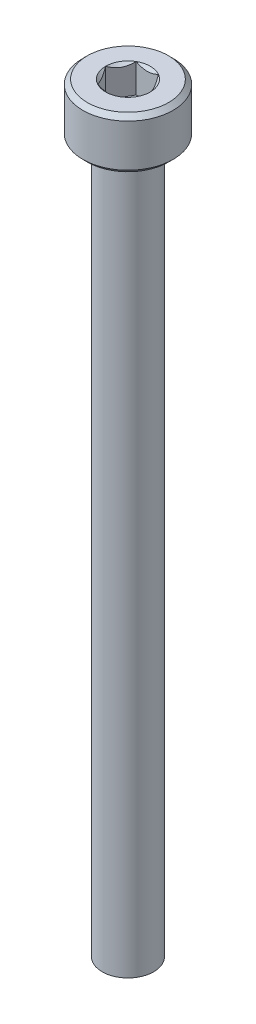
ISO-10303-21;
HEADER;
FILE_DESCRIPTION(('STEP AP214'),'2;1');
FILE_NAME('part.step','',(''),(''),'','','');
FILE_SCHEMA(('AUTOMOTIVE_DESIGN { 1 0 10303 214 1 1 1 1 }'));
ENDSEC;
DATA;
#1=APPLICATION_CONTEXT('core data for automotive mechanical design processes');
#2=APPLICATION_PROTOCOL_DEFINITION('international standard','automotive_design',2000,#1);
#3=PRODUCT_CONTEXT('',#1,'mechanical');
#4=PRODUCT('Part','Part','',(#3));
#5=PRODUCT_RELATED_PRODUCT_CATEGORY('part','',(#4));
#6=PRODUCT_DEFINITION_FORMATION('','',#4);
#7=PRODUCT_DEFINITION_CONTEXT('part definition',#1,'design');
#8=PRODUCT_DEFINITION('design','',#6,#7);
#9=PRODUCT_DEFINITION_SHAPE('','',#8);
#10=(LENGTH_UNIT() NAMED_UNIT(*) SI_UNIT(.MILLI.,.METRE.));
#11=(NAMED_UNIT(*) PLANE_ANGLE_UNIT() SI_UNIT($,.RADIAN.));
#12=(NAMED_UNIT(*) SI_UNIT($,.STERADIAN.) SOLID_ANGLE_UNIT());
#13=UNCERTAINTY_MEASURE_WITH_UNIT(LENGTH_MEASURE(1.E-05),#10,'distance_accuracy_value','');
#14=(GEOMETRIC_REPRESENTATION_CONTEXT(3) GLOBAL_UNCERTAINTY_ASSIGNED_CONTEXT((#13)) GLOBAL_UNIT_ASSIGNED_CONTEXT((#10,
#11,#12)) REPRESENTATION_CONTEXT('',''));
#15=CARTESIAN_POINT('',(0.,0.,0.));
#16=DIRECTION('',(0.,0.,1.));
#17=DIRECTION('',(1.,0.,0.));
#18=AXIS2_PLACEMENT_3D('',#15,#16,#17);
#19=CARTESIAN_POINT('',(0.,4.,0.));
#20=DIRECTION('',(0.,-1.,0.));
#21=DIRECTION('',(0.,0.,-1.));
#22=AXIS2_PLACEMENT_3D('',#19,#20,#21);
#23=CYLINDRICAL_SURFACE('',#22,3.5);
#24=CARTESIAN_POINT('',(0.,0.350000000000001,0.));
#25=DIRECTION('',(0.,1.,0.));
#26=DIRECTION('',(0.,0.,1.));
#27=AXIS2_PLACEMENT_3D('',#24,#25,#26);
#28=CIRCLE('',#27,3.5);
#29=CARTESIAN_POINT('',(0.,0.350000000000001,3.5));
#30=VERTEX_POINT('',#29);
#31=EDGE_CURVE('E222',#30,#30,#28,.T.);
#32=ORIENTED_EDGE('',*,*,#31,.T.);
#33=EDGE_LOOP('',(#32));
#34=FACE_BOUND('',#33,.T.);
#35=CARTESIAN_POINT('',(0.,3.65,0.));
#36=DIRECTION('',(0.,1.,0.));
#37=DIRECTION('',(0.,0.,1.));
#38=AXIS2_PLACEMENT_3D('',#35,#36,#37);
#39=CIRCLE('',#38,3.5);
#40=CARTESIAN_POINT('',(0.,3.65,3.5));
#41=VERTEX_POINT('',#40);
#42=EDGE_CURVE('E105',#41,#41,#39,.F.);
#43=ORIENTED_EDGE('',*,*,#42,.T.);
#44=EDGE_LOOP('',(#43));
#45=FACE_BOUND('',#44,.T.);
#46=ADVANCED_FACE('F33',(#34,#45),#23,.T.);
#47=CARTESIAN_POINT('',(0.,4.,0.));
#48=DIRECTION('',(0.,1.,0.));
#49=DIRECTION('',(0.,0.,1.));
#50=AXIS2_PLACEMENT_3D('',#47,#48,#49);
#51=PLANE('',#50);
#52=CARTESIAN_POINT('',(0.,4.,0.));
#53=DIRECTION('',(0.,1.,0.));
#54=DIRECTION('',(0.,0.,1.));
#55=AXIS2_PLACEMENT_3D('',#52,#53,#54);
#56=CIRCLE('',#55,3.15);
#57=CARTESIAN_POINT('',(0.,4.,3.15));
#58=VERTEX_POINT('',#57);
#59=EDGE_CURVE('E37',#58,#58,#56,.T.);
#60=ORIENTED_EDGE('',*,*,#59,.T.);
#61=EDGE_LOOP('',(#60));
#62=FACE_BOUND('',#61,.T.);
#63=CARTESIAN_POINT('',(0.,4.,0.));
#64=DIRECTION('',(0.,1.,0.));
#65=DIRECTION('',(0.,0.,1.));
#66=AXIS2_PLACEMENT_3D('',#63,#64,#65);
#67=CIRCLE('',#66,1.73205080756888);
#68=CARTESIAN_POINT('',(0.866025403784438,4.,1.5));
#69=VERTEX_POINT('',#68);
#70=CARTESIAN_POINT('',(1.73205080756888,4.,0.));
#71=VERTEX_POINT('',#70);
#72=EDGE_CURVE('E48',#69,#71,#67,.T.);
#73=ORIENTED_EDGE('',*,*,#72,.F.);
#74=CARTESIAN_POINT('',(-0.866025403784438,4.,1.5));
#75=VERTEX_POINT('',#74);
#76=EDGE_CURVE('E55',#75,#69,#67,.T.);
#77=ORIENTED_EDGE('',*,*,#76,.F.);
#78=CARTESIAN_POINT('',(-1.73205080756888,4.,0.));
#79=VERTEX_POINT('',#78);
#80=EDGE_CURVE('E128',#79,#75,#67,.T.);
#81=ORIENTED_EDGE('',*,*,#80,.F.);
#82=CARTESIAN_POINT('',(-0.866025403784439,4.,-1.5));
#83=VERTEX_POINT('',#82);
#84=EDGE_CURVE('E127',#83,#79,#67,.T.);
#85=ORIENTED_EDGE('',*,*,#84,.F.);
#86=CARTESIAN_POINT('',(0.866025403784438,4.,-1.5));
#87=VERTEX_POINT('',#86);
#88=EDGE_CURVE('E95',#87,#83,#67,.T.);
#89=ORIENTED_EDGE('',*,*,#88,.F.);
#90=EDGE_CURVE('E87',#71,#87,#67,.T.);
#91=ORIENTED_EDGE('',*,*,#90,.F.);
#92=EDGE_LOOP('',(#73,#77,#81,#85,#89,#91));
#93=FACE_BOUND('',#92,.T.);
#94=ADVANCED_FACE('F125',(#62,#93),#51,.T.);
#95=CARTESIAN_POINT('',(0.,0.,0.));
#96=DIRECTION('',(0.,1.,0.));
#97=DIRECTION('',(0.,0.,1.));
#98=AXIS2_PLACEMENT_3D('',#95,#96,#97);
#99=PLANE('',#98);
#100=CARTESIAN_POINT('',(0.,0.,0.));
#101=DIRECTION('',(0.,-1.,0.));
#102=DIRECTION('',(0.,0.,-1.));
#103=AXIS2_PLACEMENT_3D('',#100,#101,#102);
#104=CIRCLE('',#103,2.);
#105=CARTESIAN_POINT('',(0.,0.,-2.));
#106=VERTEX_POINT('',#105);
#107=EDGE_CURVE('E11',#106,#106,#104,.T.);
#108=ORIENTED_EDGE('',*,*,#107,.F.);
#109=EDGE_LOOP('',(#108));
#110=FACE_BOUND('',#109,.T.);
#111=CARTESIAN_POINT('',(0.,0.,0.));
#112=DIRECTION('',(0.,1.,0.));
#113=DIRECTION('',(0.,0.,1.));
#114=AXIS2_PLACEMENT_3D('',#111,#112,#113);
#115=CIRCLE('',#114,3.15);
#116=CARTESIAN_POINT('',(0.,0.,3.15));
#117=VERTEX_POINT('',#116);
#118=EDGE_CURVE('E220',#117,#117,#115,.F.);
#119=ORIENTED_EDGE('',*,*,#118,.T.);
#120=EDGE_LOOP('',(#119));
#121=FACE_BOUND('',#120,.T.);
#122=ADVANCED_FACE('F203',(#110,#121),#99,.F.);
#123=CARTESIAN_POINT('',(0.,4.,0.));
#124=DIRECTION('',(0.,1.,0.));
#125=DIRECTION('',(0.,0.,1.));
#126=AXIS2_PLACEMENT_3D('',#123,#124,#125);
#127=CONICAL_SURFACE('',#126,1.73205080756888,0.78539816339745);
#128=ORIENTED_EDGE('',*,*,#88,.T.);
#129=CARTESIAN_POINT('',(-1.72720812969692,4.55557851627079,-1.5));
#130=CARTESIAN_POINT('',(-1.68515175699268,4.52382990785743,-1.5));
#131=CARTESIAN_POINT('',(-1.64286104748673,4.49239259380738,-1.5));
#132=CARTESIAN_POINT('',(-1.55771581035942,4.43026908755641,-1.5));
#133=CARTESIAN_POINT('',(-1.51486114386668,4.3995830858922,-1.5));
#134=CARTESIAN_POINT('',(-1.3846813415127,4.30840719242716,-1.5));
#135=CARTESIAN_POINT('',(-1.29637976071654,4.24928834342677,-1.5));
#136=CARTESIAN_POINT('',(-1.11121478730467,4.1332309963165,-1.5));
#137=CARTESIAN_POINT('',(-1.01415038238167,4.07660955873301,-1.5));
#138=CARTESIAN_POINT('',(-0.815173408897606,3.97303688126565,-1.5));
#139=CARTESIAN_POINT('',(-0.713278669253285,3.92605304154167,-1.5));
#140=CARTESIAN_POINT('',(-0.560333774943112,3.86857266843083,-1.5));
#141=CARTESIAN_POINT('',(-0.511547982948042,3.85207538775725,-1.5));
#142=CARTESIAN_POINT('',(-0.412798620136866,3.822997512927,-1.5));
#143=CARTESIAN_POINT('',(-0.362834968437563,3.81041718859402,-1.5));
#144=CARTESIAN_POINT('',(-0.262863235444982,3.79003619414677,-1.5));
#145=CARTESIAN_POINT('',(-0.212872113808023,3.78215363274598,-1.5));
#146=CARTESIAN_POINT('',(-0.112355243569545,3.771322063969,-1.5));
#147=CARTESIAN_POINT('',(-0.0618295883726279,3.76837220852435,-1.5));
#148=CARTESIAN_POINT('',(0.037429173332384,3.76762485772485,-1.5));
#149=CARTESIAN_POINT('',(0.0861609672002989,3.76964473355808,-1.5));
#150=CARTESIAN_POINT('',(0.183206937768827,3.77832255289676,-1.5));
#151=CARTESIAN_POINT('',(0.231521073438269,3.78498094696846,-1.5));
#152=CARTESIAN_POINT('',(0.328199853425436,3.80268524412257,-1.5));
#153=CARTESIAN_POINT('',(0.376550616310328,3.81380581125704,-1.5));
#154=CARTESIAN_POINT('',(0.472195697125598,3.83984341404871,-1.5));
#155=CARTESIAN_POINT('',(0.51949010309274,3.85476013204094,-1.5));
#156=CARTESIAN_POINT('',(0.668391282696624,3.90733522359607,-1.5));
#157=CARTESIAN_POINT('',(0.767878709508552,3.95098128747198,-1.5));
#158=CARTESIAN_POINT('',(0.962179866690724,4.0480229945931,-1.5));
#159=CARTESIAN_POINT('',(1.05697519961444,4.10145366508953,-1.5));
#160=CARTESIAN_POINT('',(1.23814273533383,4.21168585200456,-1.5));
#161=CARTESIAN_POINT('',(1.3246994218129,4.2681879206986,-1.5));
#162=CARTESIAN_POINT('',(1.45222331290673,4.35553430157866,-1.5));
#163=CARTESIAN_POINT('',(1.49418091978756,4.38495775868004,-1.5));
#164=CARTESIAN_POINT('',(1.57752272931476,4.44458282183046,-1.5));
#165=CARTESIAN_POINT('',(1.61890708647354,4.47478421166444,-1.5));
#166=CARTESIAN_POINT('',(1.66005278019494,4.50530817860946,-1.5));
#167=B_SPLINE_CURVE_WITH_KNOTS('',3,(#129,#130,#131,#132,#133,#134,#135,#136,#137,#138,#139,
#140,#141,#142,#143,#144,#145,#146,#147,#148,#149,#150,#151,#152,#153,#154,#155,#156,#157,#158,
#159,#160,#161,#162,#163,#164,#165,#166),.UNSPECIFIED.,.F.,.F.,(4,2,2,2,2,2,2,2,2,2,2,2,2,2,2,2,
2,2,4),(0.,0.158079548982669,0.316198780993942,0.634850417346958,0.971690311361509,
1.30737131660667,1.46173961127089,1.61611853740677,1.76772101421409,1.91929742368538,
2.065387412096,2.21149159305544,2.36014984633872,2.50879566386709,2.83376031422673,
3.15991186985652,3.46985601802197,3.62358896039974,3.7772796264207),.UNSPECIFIED.);
#168=EDGE_CURVE('E100',#87,#83,#167,.F.);
#169=ORIENTED_EDGE('',*,*,#168,.F.);
#170=EDGE_LOOP('',(#128,#169));
#171=FACE_BOUND('',#170,.T.);
#172=ADVANCED_FACE('F101',(#171),#127,.F.);
#173=ORIENTED_EDGE('',*,*,#84,.T.);
#174=CARTESIAN_POINT('',(-0.865909933730601,4.00011548160007,-1.5002));
#175=CARTESIAN_POINT('',(-0.895682611594166,3.97036547606733,-1.44863220926292));
#176=CARTESIAN_POINT('',(-0.925953159489765,3.94236248391031,-1.3962020823348));
#177=CARTESIAN_POINT('',(-0.987678321317123,3.89108923044014,-1.2892909659444));
#178=CARTESIAN_POINT('',(-1.01913880822717,3.86784750504437,-1.23479980418534));
#179=CARTESIAN_POINT('',(-1.08257741237344,3.82803372899222,-1.12492091864275));
#180=CARTESIAN_POINT('',(-1.11453936608521,3.8113615856709,-1.0695611909048));
#181=CARTESIAN_POINT('',(-1.1791670593912,3.7856744568181,-0.957622742522849));
#182=CARTESIAN_POINT('',(-1.21183082354213,3.77664029047887,-0.901047443446992));
#183=CARTESIAN_POINT('',(-1.26812411040032,3.76848908122685,-0.803544610483559));
#184=CARTESIAN_POINT('',(-1.29168087824208,3.76728225298922,-0.762743091719534));
#185=CARTESIAN_POINT('',(-1.33875285845138,3.76931405716227,-0.681212030384142));
#186=CARTESIAN_POINT('',(-1.36226806050018,3.77255367074831,-0.64048250568537));
#187=CARTESIAN_POINT('',(-1.40907206156905,3.78329198598196,-0.559415597836584));
#188=CARTESIAN_POINT('',(-1.43236062923612,3.79079465301873,-0.519078615401712));
#189=CARTESIAN_POINT('',(-1.47854689118996,3.80965161192829,-0.439081663085969));
#190=CARTESIAN_POINT('',(-1.50144441326545,3.82100755701858,-0.399421991483792));
#191=CARTESIAN_POINT('',(-1.56009461325633,3.85472164759267,-0.297836865225515));
#192=CARTESIAN_POINT('',(-1.59548353987866,3.87962184909337,-0.236541446290311));
#193=CARTESIAN_POINT('',(-1.64751843074894,3.92165665327158,-0.146414371536686));
#194=CARTESIAN_POINT('',(-1.66466545167617,3.9364251535591,-0.116714860092282));
#195=CARTESIAN_POINT('',(-1.69864410935691,3.96731056594017,-0.0578620986162487));
#196=CARTESIAN_POINT('',(-1.71547589206761,3.98342683412171,-0.0287085957793624));
#197=CARTESIAN_POINT('',(-1.73216627762272,4.00011548160007,0.00020000000000028));
#198=B_SPLINE_CURVE_WITH_KNOTS('',3,(#174,#175,#176,#177,#178,#179,#180,#181,#182,#183,#184,
#185,#186,#187,#188,#189,#190,#191,#192,#193,#194,#195,#196,#197),.UNSPECIFIED.,.F.,.F.,(4,2,2,
2,2,2,2,2,2,2,2,4),(0.,0.199829143693304,0.400822987382388,0.598623720538181,0.795926240188889,
0.937113067959881,1.07833105577193,1.21968061668222,1.36109089931054,1.58570969637565,
1.69770705470964,1.80965120737194),.UNSPECIFIED.);
#199=EDGE_CURVE('E130',#83,#79,#198,.T.);
#200=ORIENTED_EDGE('',*,*,#199,.F.);
#201=EDGE_LOOP('',(#173,#200));
#202=FACE_BOUND('',#201,.T.);
#203=ADVANCED_FACE('F237',(#202),#127,.F.);
#204=ORIENTED_EDGE('',*,*,#80,.T.);
#205=CARTESIAN_POINT('',(-1.73216627762272,4.00011548160007,-0.000199999999999694));
#206=CARTESIAN_POINT('',(-1.70239359975915,3.97036547606733,0.051367790737076));
#207=CARTESIAN_POINT('',(-1.67212305186355,3.94236248391031,0.103797917665201));
#208=CARTESIAN_POINT('',(-1.61039789003619,3.89108923044014,0.210709034055597));
#209=CARTESIAN_POINT('',(-1.57893740312614,3.86784750504437,0.265200195814662));
#210=CARTESIAN_POINT('',(-1.51549879897987,3.82803372899222,0.375079081357249));
#211=CARTESIAN_POINT('',(-1.4835368452681,3.8113615856709,0.4304388090952));
#212=CARTESIAN_POINT('',(-1.41890915196211,3.7856744568181,0.542377257477151));
#213=CARTESIAN_POINT('',(-1.38624538781118,3.77664029047887,0.598952556553009));
#214=CARTESIAN_POINT('',(-1.32995210095299,3.76848908122685,0.696455389516441));
#215=CARTESIAN_POINT('',(-1.30639533311124,3.76728225298922,0.737256908280466));
#216=CARTESIAN_POINT('',(-1.25932335290193,3.76931405716227,0.818787969615858));
#217=CARTESIAN_POINT('',(-1.23580815085313,3.77255367074831,0.85951749431463));
#218=CARTESIAN_POINT('',(-1.18900414978427,3.78329198598196,0.940584402163416));
#219=CARTESIAN_POINT('',(-1.1657155821172,3.79079465301873,0.980921384598288));
#220=CARTESIAN_POINT('',(-1.11952932016335,3.80965161192829,1.06091833691403));
#221=CARTESIAN_POINT('',(-1.09663179808786,3.82100755701859,1.10057800851621));
#222=CARTESIAN_POINT('',(-1.03798159809698,3.85472164759267,1.20216313477448));
#223=CARTESIAN_POINT('',(-1.00259267147465,3.87962184909337,1.26345855370969));
#224=CARTESIAN_POINT('',(-0.950557780604375,3.92165665327158,1.35358562846331));
#225=CARTESIAN_POINT('',(-0.933410759677147,3.9364251535591,1.38328513990772));
#226=CARTESIAN_POINT('',(-0.899432101996407,3.96731056594017,1.44213790138375));
#227=CARTESIAN_POINT('',(-0.88260031928571,3.98342683412171,1.47129140422064));
#228=CARTESIAN_POINT('',(-0.865909933730601,4.00011548160007,1.5002));
#229=B_SPLINE_CURVE_WITH_KNOTS('',3,(#205,#206,#207,#208,#209,#210,#211,#212,#213,#214,#215,
#216,#217,#218,#219,#220,#221,#222,#223,#224,#225,#226,#227,#228),.UNSPECIFIED.,.F.,.F.,(4,2,2,
2,2,2,2,2,2,2,2,4),(0.,0.199829143693305,0.400822987382389,0.598623720538181,0.795926240188889,
0.937113067959881,1.07833105577193,1.21968061668222,1.36109089931054,1.58570969637565,
1.69770705470964,1.80965120737194),.UNSPECIFIED.);
#230=EDGE_CURVE('E139',#79,#75,#229,.T.);
#231=ORIENTED_EDGE('',*,*,#230,.F.);
#232=EDGE_LOOP('',(#204,#231));
#233=FACE_BOUND('',#232,.T.);
#234=ADVANCED_FACE('F252',(#233),#127,.F.);
#235=ORIENTED_EDGE('',*,*,#76,.T.);
#236=CARTESIAN_POINT('',(-1.72720812994822,4.55557851646053,1.5));
#237=CARTESIAN_POINT('',(-1.68515175723693,4.52382990803985,1.5));
#238=CARTESIAN_POINT('',(-1.64286104772391,4.49239259398251,1.5));
#239=CARTESIAN_POINT('',(-1.55771581058238,4.43026908771699,1.5));
#240=CARTESIAN_POINT('',(-1.51486114408249,4.39958308604553,1.5));
#241=CARTESIAN_POINT('',(-1.38468134170665,4.30840719255859,1.5));
#242=CARTESIAN_POINT('',(-1.29637976089561,4.24928834354366,1.5));
#243=CARTESIAN_POINT('',(-1.11121478745132,4.13323099640349,1.5));
#244=CARTESIAN_POINT('',(-1.01415038251067,4.07660955880473,1.5));
#245=CARTESIAN_POINT('',(-0.815173408989814,3.9730368813091,1.5));
#246=CARTESIAN_POINT('',(-0.71327866932636,3.92605304157206,1.5));
#247=CARTESIAN_POINT('',(-0.56033377500179,3.86857266845154,1.5));
#248=CARTESIAN_POINT('',(-0.511547983012749,3.85207538777834,1.5));
#249=CARTESIAN_POINT('',(-0.412798620213828,3.82299751294763,1.5));
#250=CARTESIAN_POINT('',(-0.362834968520751,3.8104171886138,1.5));
#251=CARTESIAN_POINT('',(-0.262863235540417,3.79003619416346,1.5));
#252=CARTESIAN_POINT('',(-0.212872113909475,3.78215363276045,1.5));
#253=CARTESIAN_POINT('',(-0.112355243682832,3.77132206397768,1.5));
#254=CARTESIAN_POINT('',(-0.061829588491731,3.76837220852945,1.5));
#255=CARTESIAN_POINT('',(0.0374291732025493,3.76762485772178,1.5));
#256=CARTESIAN_POINT('',(0.086160967065534,3.76964473355048,1.5));
#257=CARTESIAN_POINT('',(0.183206937624695,3.77832255287941,1.5));
#258=CARTESIAN_POINT('',(0.2315210732897,3.78498094694588,1.5));
#259=CARTESIAN_POINT('',(0.328199853268108,3.80268524408904,1.5));
#260=CARTESIAN_POINT('',(0.376550616148692,3.81380581121775,1.5));
#261=CARTESIAN_POINT('',(0.47219569695576,3.83984341399777,1.5));
#262=CARTESIAN_POINT('',(0.51949010291901,3.8547601319841,1.5));
#263=CARTESIAN_POINT('',(0.668391282485064,3.90733522351148,1.5));
#264=CARTESIAN_POINT('',(0.767878709264951,3.95098128736184,1.5));
#265=CARTESIAN_POINT('',(0.9621798663855,4.04802299442906,1.5));
#266=CARTESIAN_POINT('',(1.05697519927965,4.10145366489712,1.5));
#267=CARTESIAN_POINT('',(1.23814273494588,4.21168585175783,1.5));
#268=CARTESIAN_POINT('',(1.32469942140117,4.26818792042618,1.5));
#269=CARTESIAN_POINT('',(1.45222331245985,4.35553430126784,1.5));
#270=CARTESIAN_POINT('',(1.49418091932912,4.38495775835653,1.5));
#271=CARTESIAN_POINT('',(1.5775227288333,4.44458282148157,1.5));
#272=CARTESIAN_POINT('',(1.6189070859806,4.47478421130286,1.5));
#273=CARTESIAN_POINT('',(1.66005277969054,4.50530817823521,1.5));
#274=B_SPLINE_CURVE_WITH_KNOTS('',3,(#236,#237,#238,#239,#240,#241,#242,#243,#244,#245,#246,
#247,#248,#249,#250,#251,#252,#253,#254,#255,#256,#257,#258,#259,#260,#261,#262,#263,#264,#265,
#266,#267,#268,#269,#270,#271,#272,#273),.UNSPECIFIED.,.F.,.F.,(4,2,2,2,2,2,2,2,2,2,2,2,2,2,2,2,
2,2,4),(0.,0.158079549012757,0.316198781054129,0.634850417468465,0.971690311551782,
1.30737131686505,1.46173961151184,1.61611853763032,1.76772101442095,1.91929742387554,
2.06538741227089,2.21149159321503,2.36014984648185,2.50879566399376,2.83376031423511,
3.15991186974582,3.4698560178094,3.62358896013692,3.77727962610764),.UNSPECIFIED.);
#275=EDGE_CURVE('E166',#75,#69,#274,.T.);
#276=ORIENTED_EDGE('',*,*,#275,.F.);
#277=EDGE_LOOP('',(#235,#276));
#278=FACE_BOUND('',#277,.T.);
#279=ADVANCED_FACE('F282',(#278),#127,.F.);
#280=ORIENTED_EDGE('',*,*,#72,.T.);
#281=CARTESIAN_POINT('',(0.865909933730601,4.00011548160007,1.5002));
#282=CARTESIAN_POINT('',(0.895682611594166,3.97036547606733,1.44863220926292));
#283=CARTESIAN_POINT('',(0.925953159489765,3.94236248391031,1.3962020823348));
#284=CARTESIAN_POINT('',(0.987678321317124,3.89108923044014,1.2892909659444));
#285=CARTESIAN_POINT('',(1.01913880822717,3.86784750504437,1.23479980418534));
#286=CARTESIAN_POINT('',(1.08257741237344,3.82803372899222,1.12492091864275));
#287=CARTESIAN_POINT('',(1.11453936608521,3.8113615856709,1.0695611909048));
#288=CARTESIAN_POINT('',(1.1791670593912,3.7856744568181,0.95762274252285));
#289=CARTESIAN_POINT('',(1.21183082354213,3.77664029047887,0.901047443446992));
#290=CARTESIAN_POINT('',(1.26812411040032,3.76848908122685,0.80354461048356));
#291=CARTESIAN_POINT('',(1.29168087824208,3.76728225298922,0.762743091719534));
#292=CARTESIAN_POINT('',(1.33875285845138,3.76931405716227,0.681212030384142));
#293=CARTESIAN_POINT('',(1.36226806050018,3.77255367074831,0.640482505685371));
#294=CARTESIAN_POINT('',(1.40907206156905,3.78329198598196,0.559415597836584));
#295=CARTESIAN_POINT('',(1.43236062923612,3.79079465301873,0.519078615401712));
#296=CARTESIAN_POINT('',(1.47854689118996,3.80965161192829,0.43908166308597));
#297=CARTESIAN_POINT('',(1.50144441326545,3.82100755701859,0.399421991483792));
#298=CARTESIAN_POINT('',(1.56009461325633,3.85472164759267,0.297836865225515));
#299=CARTESIAN_POINT('',(1.59548353987866,3.87962184909337,0.236541446290311));
#300=CARTESIAN_POINT('',(1.64751843074894,3.92165665327158,0.146414371536686));
#301=CARTESIAN_POINT('',(1.66466545167617,3.9364251535591,0.116714860092282));
#302=CARTESIAN_POINT('',(1.69864410935691,3.96731056594017,0.0578620986162488));
#303=CARTESIAN_POINT('',(1.71547589206761,3.98342683412171,0.0287085957793626));
#304=CARTESIAN_POINT('',(1.73216627762272,4.00011548160007,-0.000200000000000026));
#305=B_SPLINE_CURVE_WITH_KNOTS('',3,(#281,#282,#283,#284,#285,#286,#287,#288,#289,#290,#291,
#292,#293,#294,#295,#296,#297,#298,#299,#300,#301,#302,#303,#304),.UNSPECIFIED.,.F.,.F.,(4,2,2,
2,2,2,2,2,2,2,2,4),(0.,0.199829143693305,0.400822987382389,0.59862372053818,0.795926240188889,
0.937113067959881,1.07833105577193,1.21968061668222,1.36109089931054,1.58570969637565,
1.69770705470964,1.80965120737194),.UNSPECIFIED.);
#306=EDGE_CURVE('E115',#69,#71,#305,.T.);
#307=ORIENTED_EDGE('',*,*,#306,.F.);
#308=EDGE_LOOP('',(#280,#307));
#309=FACE_BOUND('',#308,.T.);
#310=ADVANCED_FACE('F153',(#309),#127,.F.);
#311=ORIENTED_EDGE('',*,*,#90,.T.);
#312=CARTESIAN_POINT('',(1.73216627762272,4.00011548160007,0.000200000000000282));
#313=CARTESIAN_POINT('',(1.70239359975915,3.97036547606733,-0.0513677907370753));
#314=CARTESIAN_POINT('',(1.67212305186355,3.94236248391031,-0.103797917665201));
#315=CARTESIAN_POINT('',(1.61039789003619,3.89108923044014,-0.210709034055596));
#316=CARTESIAN_POINT('',(1.57893740312614,3.86784750504437,-0.265200195814661));
#317=CARTESIAN_POINT('',(1.51549879897987,3.82803372899222,-0.375079081357248));
#318=CARTESIAN_POINT('',(1.4835368452681,3.8113615856709,-0.430438809095199));
#319=CARTESIAN_POINT('',(1.41890915196211,3.7856744568181,-0.54237725747715));
#320=CARTESIAN_POINT('',(1.38624538781118,3.77664029047887,-0.598952556553008));
#321=CARTESIAN_POINT('',(1.32995210095299,3.76848908122685,-0.69645538951644));
#322=CARTESIAN_POINT('',(1.30639533311124,3.76728225298922,-0.737256908280466));
#323=CARTESIAN_POINT('',(1.25932335290193,3.76931405716227,-0.818787969615858));
#324=CARTESIAN_POINT('',(1.23580815085313,3.77255367074831,-0.85951749431463));
#325=CARTESIAN_POINT('',(1.18900414978427,3.78329198598196,-0.940584402163416));
#326=CARTESIAN_POINT('',(1.1657155821172,3.79079465301873,-0.980921384598288));
#327=CARTESIAN_POINT('',(1.11952932016335,3.80965161192829,-1.06091833691403));
#328=CARTESIAN_POINT('',(1.09663179808786,3.82100755701858,-1.10057800851621));
#329=CARTESIAN_POINT('',(1.03798159809698,3.85472164759267,-1.20216313477448));
#330=CARTESIAN_POINT('',(1.00259267147465,3.87962184909337,-1.26345855370969));
#331=CARTESIAN_POINT('',(0.950557780604375,3.92165665327158,-1.35358562846331));
#332=CARTESIAN_POINT('',(0.933410759677148,3.9364251535591,-1.38328513990772));
#333=CARTESIAN_POINT('',(0.899432101996407,3.96731056594017,-1.44213790138375));
#334=CARTESIAN_POINT('',(0.88260031928571,3.98342683412171,-1.47129140422064));
#335=CARTESIAN_POINT('',(0.865909933730601,4.00011548160007,-1.5002));
#336=B_SPLINE_CURVE_WITH_KNOTS('',3,(#312,#313,#314,#315,#316,#317,#318,#319,#320,#321,#322,
#323,#324,#325,#326,#327,#328,#329,#330,#331,#332,#333,#334,#335),.UNSPECIFIED.,.F.,.F.,(4,2,2,
2,2,2,2,2,2,2,2,4),(0.,0.199829143693305,0.400822987382389,0.598623720538181,0.79592624018889,
0.937113067959881,1.07833105577193,1.21968061668222,1.36109089931054,1.58570969637566,
1.69770705470964,1.80965120737194),.UNSPECIFIED.);
#337=EDGE_CURVE('E91',#71,#87,#336,.T.);
#338=ORIENTED_EDGE('',*,*,#337,.F.);
#339=EDGE_LOOP('',(#311,#338));
#340=FACE_BOUND('',#339,.T.);
#341=ADVANCED_FACE('F89',(#340),#127,.F.);
#342=CARTESIAN_POINT('',(0.,1.75,0.));
#343=DIRECTION('',(0.,1.,0.));
#344=DIRECTION('',(0.,0.,1.));
#345=AXIS2_PLACEMENT_3D('',#342,#343,#344);
#346=PLANE('',#345);
#347=DIRECTION('',(-0.5,0.,-0.866025403784439));
#348=VECTOR('',#347,1.);
#349=CARTESIAN_POINT('',(1.73205080756888,1.75,0.));
#350=LINE('',#349,#348);
#351=CARTESIAN_POINT('',(1.73205080756888,1.75,0.));
#352=VERTEX_POINT('',#351);
#353=CARTESIAN_POINT('',(0.866025403784438,1.75,-1.5));
#354=VERTEX_POINT('',#353);
#355=EDGE_CURVE('E114',#352,#354,#350,.T.);
#356=ORIENTED_EDGE('',*,*,#355,.T.);
#357=DIRECTION('',(-1.,0.,0.));
#358=VECTOR('',#357,1.);
#359=CARTESIAN_POINT('',(0.866025403784438,1.75,-1.5));
#360=LINE('',#359,#358);
#361=CARTESIAN_POINT('',(-0.866025403784439,1.75,-1.5));
#362=VERTEX_POINT('',#361);
#363=EDGE_CURVE('E119',#354,#362,#360,.T.);
#364=ORIENTED_EDGE('',*,*,#363,.T.);
#365=DIRECTION('',(-0.5,0.,0.866025403784439));
#366=VECTOR('',#365,1.);
#367=CARTESIAN_POINT('',(-0.866025403784439,1.75,-1.5));
#368=LINE('',#367,#366);
#369=CARTESIAN_POINT('',(-1.73205080756888,1.75,0.));
#370=VERTEX_POINT('',#369);
#371=EDGE_CURVE('E276',#362,#370,#368,.T.);
#372=ORIENTED_EDGE('',*,*,#371,.T.);
#373=DIRECTION('',(0.5,0.,0.866025403784439));
#374=VECTOR('',#373,1.);
#375=CARTESIAN_POINT('',(-1.73205080756888,1.75,0.));
#376=LINE('',#375,#374);
#377=CARTESIAN_POINT('',(-0.866025403784438,1.75,1.5));
#378=VERTEX_POINT('',#377);
#379=EDGE_CURVE('E259',#370,#378,#376,.T.);
#380=ORIENTED_EDGE('',*,*,#379,.T.);
#381=DIRECTION('',(1.,0.,0.));
#382=VECTOR('',#381,1.);
#383=CARTESIAN_POINT('',(-0.866025403784438,1.75,1.5));
#384=LINE('',#383,#382);
#385=CARTESIAN_POINT('',(0.866025403784439,1.75,1.5));
#386=VERTEX_POINT('',#385);
#387=EDGE_CURVE('E272',#378,#386,#384,.T.);
#388=ORIENTED_EDGE('',*,*,#387,.T.);
#389=DIRECTION('',(0.5,0.,-0.866025403784439));
#390=VECTOR('',#389,1.);
#391=CARTESIAN_POINT('',(0.866025403784439,1.75,1.5));
#392=LINE('',#391,#390);
#393=EDGE_CURVE('E122',#386,#352,#392,.T.);
#394=ORIENTED_EDGE('',*,*,#393,.T.);
#395=EDGE_LOOP('',(#356,#364,#372,#380,#388,#394));
#396=FACE_BOUND('',#395,.T.);
#397=ADVANCED_FACE('F152',(#396),#346,.T.);
#398=CARTESIAN_POINT('',(0.866025403784438,1.75,-1.5));
#399=DIRECTION('',(0.,0.,-1.));
#400=DIRECTION('',(-1.,0.,0.));
#401=AXIS2_PLACEMENT_3D('',#398,#399,#400);
#402=PLANE('',#401);
#403=DIRECTION('',(0.,1.,0.));
#404=VECTOR('',#403,1.);
#405=CARTESIAN_POINT('',(0.866025403784438,1.75,-1.5));
#406=LINE('',#405,#404);
#407=EDGE_CURVE('E112',#354,#87,#406,.T.);
#408=ORIENTED_EDGE('',*,*,#407,.T.);
#409=ORIENTED_EDGE('',*,*,#168,.T.);
#410=DIRECTION('',(0.,1.,0.));
#411=VECTOR('',#410,1.);
#412=CARTESIAN_POINT('',(-0.866025403784439,1.75,-1.5));
#413=LINE('',#412,#411);
#414=EDGE_CURVE('E121',#362,#83,#413,.T.);
#415=ORIENTED_EDGE('',*,*,#414,.F.);
#416=ORIENTED_EDGE('',*,*,#363,.F.);
#417=EDGE_LOOP('',(#408,#409,#415,#416));
#418=FACE_BOUND('',#417,.T.);
#419=ADVANCED_FACE('F117',(#418),#402,.F.);
#420=CARTESIAN_POINT('',(-0.866025403784439,1.75,-1.5));
#421=DIRECTION('',(-0.866025403784439,0.,-0.5));
#422=DIRECTION('',(-0.5,0.,0.866025403784439));
#423=AXIS2_PLACEMENT_3D('',#420,#421,#422);
#424=PLANE('',#423);
#425=ORIENTED_EDGE('',*,*,#414,.T.);
#426=ORIENTED_EDGE('',*,*,#199,.T.);
#427=DIRECTION('',(0.,1.,0.));
#428=VECTOR('',#427,1.);
#429=CARTESIAN_POINT('',(-1.73205080756888,1.75,0.));
#430=LINE('',#429,#428);
#431=EDGE_CURVE('E255',#370,#79,#430,.T.);
#432=ORIENTED_EDGE('',*,*,#431,.F.);
#433=ORIENTED_EDGE('',*,*,#371,.F.);
#434=EDGE_LOOP('',(#425,#426,#432,#433));
#435=FACE_BOUND('',#434,.T.);
#436=ADVANCED_FACE('F145',(#435),#424,.F.);
#437=CARTESIAN_POINT('',(-1.73205080756888,1.75,0.));
#438=DIRECTION('',(-0.866025403784439,0.,0.5));
#439=DIRECTION('',(0.5,0.,0.866025403784439));
#440=AXIS2_PLACEMENT_3D('',#437,#438,#439);
#441=PLANE('',#440);
#442=ORIENTED_EDGE('',*,*,#431,.T.);
#443=ORIENTED_EDGE('',*,*,#230,.T.);
#444=DIRECTION('',(0.,1.,0.));
#445=VECTOR('',#444,1.);
#446=CARTESIAN_POINT('',(-0.866025403784438,1.75,1.5));
#447=LINE('',#446,#445);
#448=EDGE_CURVE('E261',#378,#75,#447,.T.);
#449=ORIENTED_EDGE('',*,*,#448,.F.);
#450=ORIENTED_EDGE('',*,*,#379,.F.);
#451=EDGE_LOOP('',(#442,#443,#449,#450));
#452=FACE_BOUND('',#451,.T.);
#453=ADVANCED_FACE('F187',(#452),#441,.F.);
#454=CARTESIAN_POINT('',(-0.866025403784438,1.75,1.5));
#455=DIRECTION('',(0.,0.,1.));
#456=DIRECTION('',(1.,0.,0.));
#457=AXIS2_PLACEMENT_3D('',#454,#455,#456);
#458=PLANE('',#457);
#459=ORIENTED_EDGE('',*,*,#448,.T.);
#460=ORIENTED_EDGE('',*,*,#275,.T.);
#461=DIRECTION('',(0.,1.,0.));
#462=VECTOR('',#461,1.);
#463=CARTESIAN_POINT('',(0.866025403784439,1.75,1.5));
#464=LINE('',#463,#462);
#465=EDGE_CURVE('E263',#386,#69,#464,.T.);
#466=ORIENTED_EDGE('',*,*,#465,.F.);
#467=ORIENTED_EDGE('',*,*,#387,.F.);
#468=EDGE_LOOP('',(#459,#460,#466,#467));
#469=FACE_BOUND('',#468,.T.);
#470=ADVANCED_FACE('F183',(#469),#458,.F.);
#471=CARTESIAN_POINT('',(0.866025403784439,1.75,1.5));
#472=DIRECTION('',(0.866025403784439,0.,0.5));
#473=DIRECTION('',(0.5,0.,-0.866025403784439));
#474=AXIS2_PLACEMENT_3D('',#471,#472,#473);
#475=PLANE('',#474);
#476=ORIENTED_EDGE('',*,*,#465,.T.);
#477=ORIENTED_EDGE('',*,*,#306,.T.);
#478=DIRECTION('',(0.,1.,0.));
#479=VECTOR('',#478,1.);
#480=CARTESIAN_POINT('',(1.73205080756888,1.75,0.));
#481=LINE('',#480,#479);
#482=EDGE_CURVE('E106',#352,#71,#481,.T.);
#483=ORIENTED_EDGE('',*,*,#482,.F.);
#484=ORIENTED_EDGE('',*,*,#393,.F.);
#485=EDGE_LOOP('',(#476,#477,#483,#484));
#486=FACE_BOUND('',#485,.T.);
#487=ADVANCED_FACE('F180',(#486),#475,.F.);
#488=CARTESIAN_POINT('',(1.73205080756888,1.75,0.));
#489=DIRECTION('',(0.866025403784439,0.,-0.5));
#490=DIRECTION('',(-0.5,0.,-0.866025403784439));
#491=AXIS2_PLACEMENT_3D('',#488,#489,#490);
#492=PLANE('',#491);
#493=ORIENTED_EDGE('',*,*,#482,.T.);
#494=ORIENTED_EDGE('',*,*,#337,.T.);
#495=ORIENTED_EDGE('',*,*,#407,.F.);
#496=ORIENTED_EDGE('',*,*,#355,.F.);
#497=EDGE_LOOP('',(#493,#494,#495,#496));
#498=FACE_BOUND('',#497,.T.);
#499=ADVANCED_FACE('F110',(#498),#492,.F.);
#500=CARTESIAN_POINT('',(0.,0.350000000000001,0.));
#501=DIRECTION('',(0.,1.,0.));
#502=DIRECTION('',(0.,0.,1.));
#503=AXIS2_PLACEMENT_3D('',#500,#501,#502);
#504=CONICAL_SURFACE('',#503,3.5,0.78539816339745);
#505=ORIENTED_EDGE('',*,*,#118,.F.);
#506=EDGE_LOOP('',(#505));
#507=FACE_BOUND('',#506,.T.);
#508=ORIENTED_EDGE('',*,*,#31,.F.);
#509=EDGE_LOOP('',(#508));
#510=FACE_BOUND('',#509,.T.);
#511=ADVANCED_FACE('F209',(#507,#510),#504,.T.);
#512=CARTESIAN_POINT('',(0.,4.,0.));
#513=DIRECTION('',(0.,-1.,0.));
#514=DIRECTION('',(0.,0.,-1.));
#515=AXIS2_PLACEMENT_3D('',#512,#513,#514);
#516=CONICAL_SURFACE('',#515,3.15,0.785398163397448);
#517=ORIENTED_EDGE('',*,*,#42,.F.);
#518=EDGE_LOOP('',(#517));
#519=FACE_BOUND('',#518,.T.);
#520=ORIENTED_EDGE('',*,*,#59,.F.);
#521=EDGE_LOOP('',(#520));
#522=FACE_BOUND('',#521,.T.);
#523=ADVANCED_FACE('F35',(#519,#522),#516,.T.);
#524=CARTESIAN_POINT('',(0.,-55.,0.));
#525=DIRECTION('',(0.,1.,0.));
#526=DIRECTION('',(0.,0.,1.));
#527=AXIS2_PLACEMENT_3D('',#524,#525,#526);
#528=CYLINDRICAL_SURFACE('',#527,2.);
#529=CARTESIAN_POINT('',(0.,-55.,0.));
#530=DIRECTION('',(0.,-1.,0.));
#531=DIRECTION('',(0.,0.,-1.));
#532=AXIS2_PLACEMENT_3D('',#529,#530,#531);
#533=CIRCLE('',#532,2.);
#534=CARTESIAN_POINT('',(0.,-55.,-2.));
#535=VERTEX_POINT('',#534);
#536=EDGE_CURVE('E248',#535,#535,#533,.T.);
#537=ORIENTED_EDGE('',*,*,#536,.F.);
#538=EDGE_LOOP('',(#537));
#539=FACE_BOUND('',#538,.T.);
#540=ORIENTED_EDGE('',*,*,#107,.T.);
#541=EDGE_LOOP('',(#540));
#542=FACE_BOUND('',#541,.T.);
#543=ADVANCED_FACE('F154',(#539,#542),#528,.T.);
#544=CARTESIAN_POINT('',(0.,-55.,0.));
#545=DIRECTION('',(0.,-1.,0.));
#546=DIRECTION('',(0.,0.,-1.));
#547=AXIS2_PLACEMENT_3D('',#544,#545,#546);
#548=PLANE('',#547);
#549=ORIENTED_EDGE('',*,*,#536,.T.);
#550=EDGE_LOOP('',(#549));
#551=FACE_BOUND('',#550,.T.);
#552=ADVANCED_FACE('F241',(#551),#548,.T.);
#553=CLOSED_SHELL('',(#46,#94,#122,#172,#203,#234,#279,#310,#341,#397,#419,#436,#453,#470,#487,
#499,#511,#523,#543,#552));
#554=MANIFOLD_SOLID_BREP('B2',#553);
#555=ADVANCED_BREP_SHAPE_REPRESENTATION('',(#18,#554),#14);
#556=SHAPE_DEFINITION_REPRESENTATION(#9,#555);
ENDSEC;
END-ISO-10303-21;
